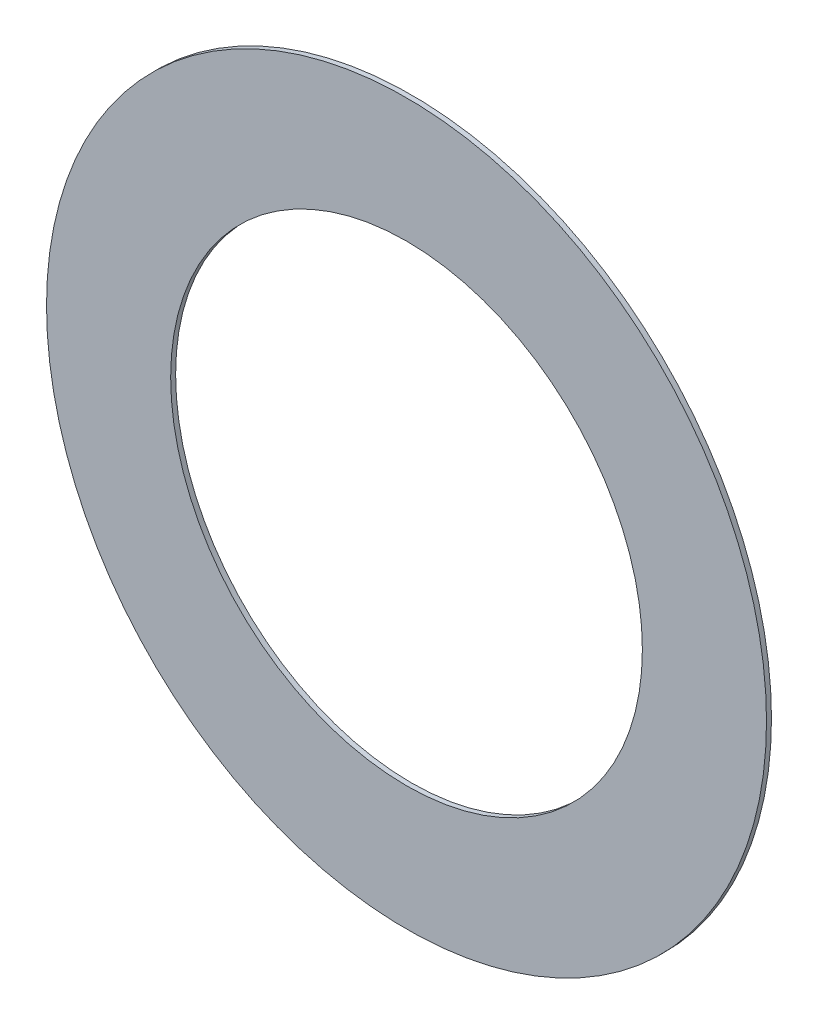
ISO-10303-21;
HEADER;
FILE_DESCRIPTION(('STEP AP214'),'2;1');
FILE_NAME('part.step','',(''),(''),'','','');
FILE_SCHEMA(('AUTOMOTIVE_DESIGN { 1 0 10303 214 1 1 1 1 }'));
ENDSEC;
DATA;
#1=APPLICATION_CONTEXT('core data for automotive mechanical design processes');
#2=APPLICATION_PROTOCOL_DEFINITION('international standard','automotive_design',2000,#1);
#3=PRODUCT_CONTEXT('',#1,'mechanical');
#4=PRODUCT('Part','Part','',(#3));
#5=PRODUCT_RELATED_PRODUCT_CATEGORY('part','',(#4));
#6=PRODUCT_DEFINITION_FORMATION('','',#4);
#7=PRODUCT_DEFINITION_CONTEXT('part definition',#1,'design');
#8=PRODUCT_DEFINITION('design','',#6,#7);
#9=PRODUCT_DEFINITION_SHAPE('','',#8);
#10=(LENGTH_UNIT() NAMED_UNIT(*) SI_UNIT(.MILLI.,.METRE.));
#11=(NAMED_UNIT(*) PLANE_ANGLE_UNIT() SI_UNIT($,.RADIAN.));
#12=(NAMED_UNIT(*) SI_UNIT($,.STERADIAN.) SOLID_ANGLE_UNIT());
#13=UNCERTAINTY_MEASURE_WITH_UNIT(LENGTH_MEASURE(1.E-05),#10,'distance_accuracy_value','');
#14=(GEOMETRIC_REPRESENTATION_CONTEXT(3) GLOBAL_UNCERTAINTY_ASSIGNED_CONTEXT((#13)) GLOBAL_UNIT_ASSIGNED_CONTEXT((#10,
#11,#12)) REPRESENTATION_CONTEXT('',''));
#15=CARTESIAN_POINT('',(0.,0.,0.));
#16=DIRECTION('',(0.,0.,1.));
#17=DIRECTION('',(1.,0.,0.));
#18=AXIS2_PLACEMENT_3D('',#15,#16,#17);
#19=CARTESIAN_POINT('',(-6.225,-8.39,0.));
#20=DIRECTION('',(0.,0.,1.));
#21=DIRECTION('',(1.,0.,0.));
#22=AXIS2_PLACEMENT_3D('',#19,#20,#21);
#23=PLANE('',#22);
#24=CARTESIAN_POINT('',(1.,6.84,0.));
#25=DIRECTION('',(0.,0.,1.));
#26=DIRECTION('',(1.,0.,0.));
#27=AXIS2_PLACEMENT_3D('',#24,#25,#26);
#28=CIRCLE('',#27,0.475);
#29=CARTESIAN_POINT('',(1.475,6.84,0.));
#30=VERTEX_POINT('',#29);
#31=EDGE_CURVE('E27',#30,#30,#28,.T.);
#32=ORIENTED_EDGE('',*,*,#31,.T.);
#33=EDGE_LOOP('',(#32));
#34=FACE_BOUND('',#33,.T.);
#35=CARTESIAN_POINT('',(1.,6.84,0.));
#36=DIRECTION('',(0.,0.,1.));
#37=DIRECTION('',(1.,0.,0.));
#38=AXIS2_PLACEMENT_3D('',#35,#36,#37);
#39=CIRCLE('',#38,0.725);
#40=CARTESIAN_POINT('',(1.725,6.84,0.));
#41=VERTEX_POINT('',#40);
#42=EDGE_CURVE('E18',#41,#41,#39,.T.);
#43=ORIENTED_EDGE('',*,*,#42,.F.);
#44=EDGE_LOOP('',(#43));
#45=FACE_BOUND('',#44,.T.);
#46=ADVANCED_FACE('F15',(#34,#45),#23,.F.);
#47=CARTESIAN_POINT('',(1.,6.84,0.));
#48=DIRECTION('',(0.,0.,1.));
#49=DIRECTION('',(1.,0.,0.));
#50=AXIS2_PLACEMENT_3D('',#47,#48,#49);
#51=CYLINDRICAL_SURFACE('',#50,0.725);
#52=CARTESIAN_POINT('',(1.,6.84,0.01));
#53=DIRECTION('',(0.,0.,1.));
#54=DIRECTION('',(1.,0.,0.));
#55=AXIS2_PLACEMENT_3D('',#52,#53,#54);
#56=CIRCLE('',#55,0.725);
#57=CARTESIAN_POINT('',(1.725,6.84,0.01));
#58=VERTEX_POINT('',#57);
#59=EDGE_CURVE('E22',#58,#58,#56,.T.);
#60=ORIENTED_EDGE('',*,*,#59,.F.);
#61=EDGE_LOOP('',(#60));
#62=FACE_BOUND('',#61,.T.);
#63=ORIENTED_EDGE('',*,*,#42,.T.);
#64=EDGE_LOOP('',(#63));
#65=FACE_BOUND('',#64,.T.);
#66=ADVANCED_FACE('F35',(#62,#65),#51,.T.);
#67=CARTESIAN_POINT('',(1.,6.84,0.));
#68=DIRECTION('',(0.,0.,1.));
#69=DIRECTION('',(1.,0.,0.));
#70=AXIS2_PLACEMENT_3D('',#67,#68,#69);
#71=CYLINDRICAL_SURFACE('',#70,0.475);
#72=CARTESIAN_POINT('',(1.,6.84,0.01));
#73=DIRECTION('',(0.,0.,1.));
#74=DIRECTION('',(1.,0.,0.));
#75=AXIS2_PLACEMENT_3D('',#72,#73,#74);
#76=CIRCLE('',#75,0.475);
#77=CARTESIAN_POINT('',(1.475,6.84,0.01));
#78=VERTEX_POINT('',#77);
#79=EDGE_CURVE('E10',#78,#78,#76,.F.);
#80=ORIENTED_EDGE('',*,*,#79,.F.);
#81=EDGE_LOOP('',(#80));
#82=FACE_BOUND('',#81,.T.);
#83=ORIENTED_EDGE('',*,*,#31,.F.);
#84=EDGE_LOOP('',(#83));
#85=FACE_BOUND('',#84,.T.);
#86=ADVANCED_FACE('F42',(#82,#85),#71,.F.);
#87=CARTESIAN_POINT('',(0.,0.,0.01));
#88=DIRECTION('',(0.,0.,1.));
#89=DIRECTION('',(1.,0.,0.));
#90=AXIS2_PLACEMENT_3D('',#87,#88,#89);
#91=PLANE('',#90);
#92=ORIENTED_EDGE('',*,*,#79,.T.);
#93=EDGE_LOOP('',(#92));
#94=FACE_BOUND('',#93,.T.);
#95=ORIENTED_EDGE('',*,*,#59,.T.);
#96=EDGE_LOOP('',(#95));
#97=FACE_BOUND('',#96,.T.);
#98=ADVANCED_FACE('F44',(#94,#97),#91,.T.);
#99=CLOSED_SHELL('',(#46,#66,#86,#98));
#100=MANIFOLD_SOLID_BREP('B1',#99);
#101=ADVANCED_BREP_SHAPE_REPRESENTATION('',(#18,#100),#14);
#102=SHAPE_DEFINITION_REPRESENTATION(#9,#101);
ENDSEC;
END-ISO-10303-21;
